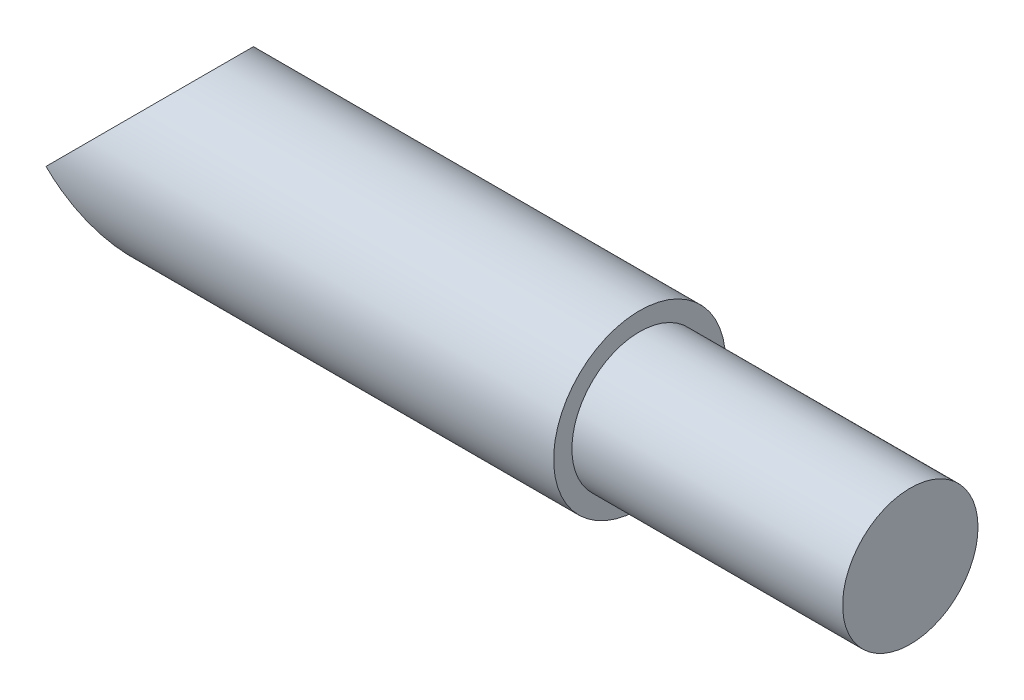
ISO-10303-21;
HEADER;
FILE_DESCRIPTION(('STEP AP214'),'2;1');
FILE_NAME('part.step','',(''),(''),'','','');
FILE_SCHEMA(('AUTOMOTIVE_DESIGN { 1 0 10303 214 1 1 1 1 }'));
ENDSEC;
DATA;
#1=APPLICATION_CONTEXT('core data for automotive mechanical design processes');
#2=APPLICATION_PROTOCOL_DEFINITION('international standard','automotive_design',2000,#1);
#3=PRODUCT_CONTEXT('',#1,'mechanical');
#4=PRODUCT('Part','Part','',(#3));
#5=PRODUCT_RELATED_PRODUCT_CATEGORY('part','',(#4));
#6=PRODUCT_DEFINITION_FORMATION('','',#4);
#7=PRODUCT_DEFINITION_CONTEXT('part definition',#1,'design');
#8=PRODUCT_DEFINITION('design','',#6,#7);
#9=PRODUCT_DEFINITION_SHAPE('','',#8);
#10=(LENGTH_UNIT() NAMED_UNIT(*) SI_UNIT(.MILLI.,.METRE.));
#11=(NAMED_UNIT(*) PLANE_ANGLE_UNIT() SI_UNIT($,.RADIAN.));
#12=(NAMED_UNIT(*) SI_UNIT($,.STERADIAN.) SOLID_ANGLE_UNIT());
#13=UNCERTAINTY_MEASURE_WITH_UNIT(LENGTH_MEASURE(1.E-05),#10,'distance_accuracy_value','');
#14=(GEOMETRIC_REPRESENTATION_CONTEXT(3) GLOBAL_UNCERTAINTY_ASSIGNED_CONTEXT((#13)) GLOBAL_UNIT_ASSIGNED_CONTEXT((#10,
#11,#12)) REPRESENTATION_CONTEXT('',''));
#15=CARTESIAN_POINT('',(0.,0.,0.));
#16=DIRECTION('',(0.,0.,1.));
#17=DIRECTION('',(1.,0.,0.));
#18=AXIS2_PLACEMENT_3D('',#15,#16,#17);
#19=CARTESIAN_POINT('',(75.,0.,0.));
#20=DIRECTION('',(-1.,0.,0.));
#21=DIRECTION('',(0.,0.,1.));
#22=AXIS2_PLACEMENT_3D('',#19,#20,#21);
#23=CYLINDRICAL_SURFACE('',#22,12.7);
#24=CARTESIAN_POINT('',(75.,0.,0.));
#25=DIRECTION('',(1.,0.,0.));
#26=DIRECTION('',(0.,0.,-1.));
#27=AXIS2_PLACEMENT_3D('',#24,#25,#26);
#28=CIRCLE('',#27,12.7);
#29=CARTESIAN_POINT('',(75.,0.,-12.7));
#30=VERTEX_POINT('',#29);
#31=EDGE_CURVE('E42',#30,#30,#28,.T.);
#32=ORIENTED_EDGE('',*,*,#31,.F.);
#33=EDGE_LOOP('',(#32));
#34=FACE_BOUND('',#33,.T.);
#35=CARTESIAN_POINT('',(0.,0.,0.));
#36=DIRECTION('',(-0.707106781186547,-0.707106781186547,0.));
#37=DIRECTION('',(-0.707106781186547,0.707106781186547,0.));
#38=AXIS2_PLACEMENT_3D('',#35,#36,#37);
#39=ELLIPSE('',#38,17.9605122421383,12.7);
#40=CARTESIAN_POINT('',(0.,0.,12.7));
#41=VERTEX_POINT('',#40);
#42=CARTESIAN_POINT('',(0.,0.,-12.7));
#43=VERTEX_POINT('',#42);
#44=EDGE_CURVE('E56',#41,#43,#39,.F.);
#45=ORIENTED_EDGE('',*,*,#44,.T.);
#46=CARTESIAN_POINT('',(0.,0.,0.));
#47=DIRECTION('',(-0.707106781186547,0.707106781186547,0.));
#48=DIRECTION('',(-0.707106781186547,-0.707106781186547,0.));
#49=AXIS2_PLACEMENT_3D('',#46,#47,#48);
#50=ELLIPSE('',#49,17.9605122421383,12.7);
#51=EDGE_CURVE('E54',#43,#41,#50,.F.);
#52=ORIENTED_EDGE('',*,*,#51,.T.);
#53=EDGE_LOOP('',(#45,#52));
#54=FACE_BOUND('',#53,.T.);
#55=ADVANCED_FACE('F39',(#34,#54),#23,.T.);
#56=CARTESIAN_POINT('',(75.,0.,0.));
#57=DIRECTION('',(1.,0.,0.));
#58=DIRECTION('',(0.,0.,-1.));
#59=AXIS2_PLACEMENT_3D('',#56,#57,#58);
#60=PLANE('',#59);
#61=CARTESIAN_POINT('',(75.,0.,0.));
#62=DIRECTION('',(1.,0.,0.));
#63=DIRECTION('',(0.,0.,-1.));
#64=AXIS2_PLACEMENT_3D('',#61,#62,#63);
#65=CIRCLE('',#64,10.);
#66=CARTESIAN_POINT('',(75.,0.,-10.));
#67=VERTEX_POINT('',#66);
#68=EDGE_CURVE('E11',#67,#67,#65,.T.);
#69=ORIENTED_EDGE('',*,*,#68,.F.);
#70=EDGE_LOOP('',(#69));
#71=FACE_BOUND('',#70,.T.);
#72=ORIENTED_EDGE('',*,*,#31,.T.);
#73=EDGE_LOOP('',(#72));
#74=FACE_BOUND('',#73,.T.);
#75=ADVANCED_FACE('F78',(#71,#74),#60,.T.);
#76=CARTESIAN_POINT('',(0.,-37.5,0.));
#77=DIRECTION('',(0.,1.,0.));
#78=DIRECTION('',(0.,0.,1.));
#79=AXIS2_PLACEMENT_3D('',#76,#77,#78);
#80=CYLINDRICAL_SURFACE('',#79,12.7);
#81=ORIENTED_EDGE('',*,*,#44,.F.);
#82=ORIENTED_EDGE('',*,*,#51,.F.);
#83=EDGE_LOOP('',(#81,#82));
#84=FACE_BOUND('',#83,.T.);
#85=ADVANCED_FACE('F57',(#84),#80,.F.);
#86=CARTESIAN_POINT('',(115.,0.,0.));
#87=DIRECTION('',(-1.,0.,0.));
#88=DIRECTION('',(0.,0.,1.));
#89=AXIS2_PLACEMENT_3D('',#86,#87,#88);
#90=CYLINDRICAL_SURFACE('',#89,10.);
#91=CARTESIAN_POINT('',(115.,0.,0.));
#92=DIRECTION('',(1.,0.,0.));
#93=DIRECTION('',(0.,0.,-1.));
#94=AXIS2_PLACEMENT_3D('',#91,#92,#93);
#95=CIRCLE('',#94,10.);
#96=CARTESIAN_POINT('',(115.,0.,-10.));
#97=VERTEX_POINT('',#96);
#98=EDGE_CURVE('E60',#97,#97,#95,.T.);
#99=ORIENTED_EDGE('',*,*,#98,.F.);
#100=EDGE_LOOP('',(#99));
#101=FACE_BOUND('',#100,.T.);
#102=ORIENTED_EDGE('',*,*,#68,.T.);
#103=EDGE_LOOP('',(#102));
#104=FACE_BOUND('',#103,.T.);
#105=ADVANCED_FACE('F72',(#101,#104),#90,.T.);
#106=CARTESIAN_POINT('',(115.,0.,0.));
#107=DIRECTION('',(1.,0.,0.));
#108=DIRECTION('',(0.,0.,-1.));
#109=AXIS2_PLACEMENT_3D('',#106,#107,#108);
#110=PLANE('',#109);
#111=ORIENTED_EDGE('',*,*,#98,.T.);
#112=EDGE_LOOP('',(#111));
#113=FACE_BOUND('',#112,.T.);
#114=ADVANCED_FACE('F70',(#113),#110,.T.);
#115=CLOSED_SHELL('',(#55,#75,#85,#105,#114));
#116=MANIFOLD_SOLID_BREP('B2',#115);
#117=ADVANCED_BREP_SHAPE_REPRESENTATION('',(#18,#116),#14);
#118=SHAPE_DEFINITION_REPRESENTATION(#9,#117);
ENDSEC;
END-ISO-10303-21;
